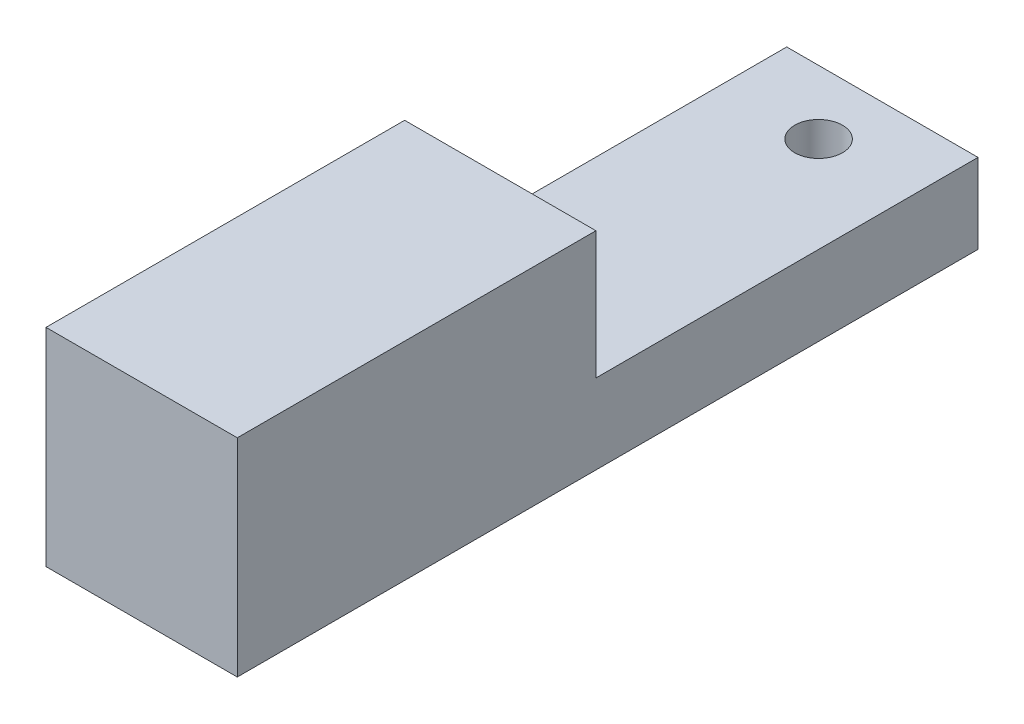
ISO-10303-21;
HEADER;
FILE_DESCRIPTION(('STEP AP214'),'2;1');
FILE_NAME('part.step','',(''),(''),'','','');
FILE_SCHEMA(('AUTOMOTIVE_DESIGN { 1 0 10303 214 1 1 1 1 }'));
ENDSEC;
DATA;
#1=APPLICATION_CONTEXT('core data for automotive mechanical design processes');
#2=APPLICATION_PROTOCOL_DEFINITION('international standard','automotive_design',2000,#1);
#3=PRODUCT_CONTEXT('',#1,'mechanical');
#4=PRODUCT('Part','Part','',(#3));
#5=PRODUCT_RELATED_PRODUCT_CATEGORY('part','',(#4));
#6=PRODUCT_DEFINITION_FORMATION('','',#4);
#7=PRODUCT_DEFINITION_CONTEXT('part definition',#1,'design');
#8=PRODUCT_DEFINITION('design','',#6,#7);
#9=PRODUCT_DEFINITION_SHAPE('','',#8);
#10=(LENGTH_UNIT() NAMED_UNIT(*) SI_UNIT(.MILLI.,.METRE.));
#11=(NAMED_UNIT(*) PLANE_ANGLE_UNIT() SI_UNIT($,.RADIAN.));
#12=(NAMED_UNIT(*) SI_UNIT($,.STERADIAN.) SOLID_ANGLE_UNIT());
#13=UNCERTAINTY_MEASURE_WITH_UNIT(LENGTH_MEASURE(1.E-05),#10,'distance_accuracy_value','');
#14=(GEOMETRIC_REPRESENTATION_CONTEXT(3) GLOBAL_UNCERTAINTY_ASSIGNED_CONTEXT((#13)) GLOBAL_UNIT_ASSIGNED_CONTEXT((#10,
#11,#12)) REPRESENTATION_CONTEXT('',''));
#15=CARTESIAN_POINT('',(0.,0.,0.));
#16=DIRECTION('',(0.,0.,1.));
#17=DIRECTION('',(1.,0.,0.));
#18=AXIS2_PLACEMENT_3D('',#15,#16,#17);
#19=CARTESIAN_POINT('',(-5.99999999999999,-5.,-23.235));
#20=DIRECTION('',(-1.,0.,0.));
#21=DIRECTION('',(0.,0.,1.));
#22=AXIS2_PLACEMENT_3D('',#19,#20,#21);
#23=PLANE('',#22);
#24=DIRECTION('',(0.,0.,1.));
#25=VECTOR('',#24,1.);
#26=CARTESIAN_POINT('',(-5.99999999999999,0.,-23.235));
#27=LINE('',#26,#25);
#28=CARTESIAN_POINT('',(-5.99999999999999,0.,-23.235));
#29=VERTEX_POINT('',#28);
#30=CARTESIAN_POINT('',(-5.99999999999999,0.,0.735));
#31=VERTEX_POINT('',#30);
#32=EDGE_CURVE('E128',#29,#31,#27,.T.);
#33=ORIENTED_EDGE('',*,*,#32,.F.);
#34=DIRECTION('',(0.,1.,0.));
#35=VECTOR('',#34,1.);
#36=CARTESIAN_POINT('',(-5.99999999999999,-5.,-23.235));
#37=LINE('',#36,#35);
#38=CARTESIAN_POINT('',(-5.99999999999999,-5.,-23.235));
#39=VERTEX_POINT('',#38);
#40=EDGE_CURVE('E11',#39,#29,#37,.T.);
#41=ORIENTED_EDGE('',*,*,#40,.F.);
#42=DIRECTION('',(0.,0.,1.));
#43=VECTOR('',#42,1.);
#44=CARTESIAN_POINT('',(-5.99999999999999,-5.,-23.235));
#45=LINE('',#44,#43);
#46=CARTESIAN_POINT('',(-5.99999999999999,-5.,23.235));
#47=VERTEX_POINT('',#46);
#48=EDGE_CURVE('E94',#39,#47,#45,.T.);
#49=ORIENTED_EDGE('',*,*,#48,.T.);
#50=DIRECTION('',(0.,1.,0.));
#51=VECTOR('',#50,1.);
#52=CARTESIAN_POINT('',(-5.99999999999999,-5.,23.235));
#53=LINE('',#52,#51);
#54=CARTESIAN_POINT('',(-5.99999999999999,8.,23.235));
#55=VERTEX_POINT('',#54);
#56=EDGE_CURVE('E36',#47,#55,#53,.T.);
#57=ORIENTED_EDGE('',*,*,#56,.T.);
#58=DIRECTION('',(0.,0.,1.));
#59=VECTOR('',#58,1.);
#60=CARTESIAN_POINT('',(-5.99999999999999,8.,23.235));
#61=LINE('',#60,#59);
#62=CARTESIAN_POINT('',(-5.99999999999999,8.,0.735));
#63=VERTEX_POINT('',#62);
#64=EDGE_CURVE('E93',#63,#55,#61,.T.);
#65=ORIENTED_EDGE('',*,*,#64,.F.);
#66=DIRECTION('',(0.,-1.,0.));
#67=VECTOR('',#66,1.);
#68=CARTESIAN_POINT('',(-5.99999999999999,8.,0.735));
#69=LINE('',#68,#67);
#70=EDGE_CURVE('E112',#63,#31,#69,.T.);
#71=ORIENTED_EDGE('',*,*,#70,.T.);
#72=EDGE_LOOP('',(#33,#41,#49,#57,#65,#71));
#73=FACE_BOUND('',#72,.T.);
#74=ADVANCED_FACE('F33',(#73),#23,.T.);
#75=CARTESIAN_POINT('',(-5.99999999999999,-5.,-23.235));
#76=DIRECTION('',(0.,0.,-1.));
#77=DIRECTION('',(-1.,0.,0.));
#78=AXIS2_PLACEMENT_3D('',#75,#76,#77);
#79=PLANE('',#78);
#80=DIRECTION('',(-1.,0.,0.));
#81=VECTOR('',#80,1.);
#82=CARTESIAN_POINT('',(-5.99999999999999,0.,-23.235));
#83=LINE('',#82,#81);
#84=CARTESIAN_POINT('',(5.99999999999999,0.,-23.235));
#85=VERTEX_POINT('',#84);
#86=EDGE_CURVE('E133',#85,#29,#83,.T.);
#87=ORIENTED_EDGE('',*,*,#86,.F.);
#88=DIRECTION('',(0.,1.,0.));
#89=VECTOR('',#88,1.);
#90=CARTESIAN_POINT('',(5.99999999999999,-5.,-23.235));
#91=LINE('',#90,#89);
#92=CARTESIAN_POINT('',(5.99999999999999,-5.,-23.235));
#93=VERTEX_POINT('',#92);
#94=EDGE_CURVE('E41',#93,#85,#91,.T.);
#95=ORIENTED_EDGE('',*,*,#94,.F.);
#96=DIRECTION('',(-1.,0.,0.));
#97=VECTOR('',#96,1.);
#98=CARTESIAN_POINT('',(-5.99999999999999,-5.,-23.235));
#99=LINE('',#98,#97);
#100=EDGE_CURVE('E96',#93,#39,#99,.T.);
#101=ORIENTED_EDGE('',*,*,#100,.T.);
#102=ORIENTED_EDGE('',*,*,#40,.T.);
#103=EDGE_LOOP('',(#87,#95,#101,#102));
#104=FACE_BOUND('',#103,.T.);
#105=ADVANCED_FACE('F150',(#104),#79,.T.);
#106=CARTESIAN_POINT('',(5.99999999999999,-5.,-23.235));
#107=DIRECTION('',(1.,0.,0.));
#108=DIRECTION('',(0.,0.,-1.));
#109=AXIS2_PLACEMENT_3D('',#106,#107,#108);
#110=PLANE('',#109);
#111=DIRECTION('',(0.,0.,-1.));
#112=VECTOR('',#111,1.);
#113=CARTESIAN_POINT('',(5.99999999999999,0.,-23.235));
#114=LINE('',#113,#112);
#115=CARTESIAN_POINT('',(5.99999999999999,0.,0.734999999999993));
#116=VERTEX_POINT('',#115);
#117=EDGE_CURVE('E140',#116,#85,#114,.T.);
#118=ORIENTED_EDGE('',*,*,#117,.F.);
#119=DIRECTION('',(0.,-1.,0.));
#120=VECTOR('',#119,1.);
#121=CARTESIAN_POINT('',(5.99999999999999,8.,0.735));
#122=LINE('',#121,#120);
#123=CARTESIAN_POINT('',(5.99999999999999,8.,0.735));
#124=VERTEX_POINT('',#123);
#125=EDGE_CURVE('E115',#124,#116,#122,.T.);
#126=ORIENTED_EDGE('',*,*,#125,.F.);
#127=DIRECTION('',(0.,0.,-1.));
#128=VECTOR('',#127,1.);
#129=CARTESIAN_POINT('',(5.99999999999999,8.,23.235));
#130=LINE('',#129,#128);
#131=CARTESIAN_POINT('',(5.99999999999999,8.,23.235));
#132=VERTEX_POINT('',#131);
#133=EDGE_CURVE('E102',#132,#124,#130,.T.);
#134=ORIENTED_EDGE('',*,*,#133,.F.);
#135=DIRECTION('',(0.,1.,0.));
#136=VECTOR('',#135,1.);
#137=CARTESIAN_POINT('',(5.99999999999999,-5.,23.235));
#138=LINE('',#137,#136);
#139=CARTESIAN_POINT('',(5.99999999999999,-5.,23.235));
#140=VERTEX_POINT('',#139);
#141=EDGE_CURVE('E95',#140,#132,#138,.T.);
#142=ORIENTED_EDGE('',*,*,#141,.F.);
#143=DIRECTION('',(0.,0.,-1.));
#144=VECTOR('',#143,1.);
#145=CARTESIAN_POINT('',(5.99999999999999,-5.,-23.235));
#146=LINE('',#145,#144);
#147=EDGE_CURVE('E135',#140,#93,#146,.T.);
#148=ORIENTED_EDGE('',*,*,#147,.T.);
#149=ORIENTED_EDGE('',*,*,#94,.T.);
#150=EDGE_LOOP('',(#118,#126,#134,#142,#148,#149));
#151=FACE_BOUND('',#150,.T.);
#152=ADVANCED_FACE('F146',(#151),#110,.T.);
#153=CARTESIAN_POINT('',(-5.99999999999999,-5.,23.235));
#154=DIRECTION('',(0.,0.,1.));
#155=DIRECTION('',(1.,0.,0.));
#156=AXIS2_PLACEMENT_3D('',#153,#154,#155);
#157=PLANE('',#156);
#158=ORIENTED_EDGE('',*,*,#141,.T.);
#159=DIRECTION('',(1.,0.,0.));
#160=VECTOR('',#159,1.);
#161=CARTESIAN_POINT('',(-5.99999999999999,8.,23.235));
#162=LINE('',#161,#160);
#163=EDGE_CURVE('E98',#55,#132,#162,.T.);
#164=ORIENTED_EDGE('',*,*,#163,.F.);
#165=ORIENTED_EDGE('',*,*,#56,.F.);
#166=DIRECTION('',(1.,0.,0.));
#167=VECTOR('',#166,1.);
#168=CARTESIAN_POINT('',(-5.99999999999999,-5.,23.235));
#169=LINE('',#168,#167);
#170=EDGE_CURVE('E132',#47,#140,#169,.T.);
#171=ORIENTED_EDGE('',*,*,#170,.T.);
#172=EDGE_LOOP('',(#158,#164,#165,#171));
#173=FACE_BOUND('',#172,.T.);
#174=ADVANCED_FACE('F99',(#173),#157,.T.);
#175=CARTESIAN_POINT('',(0.,-5.,0.));
#176=DIRECTION('',(0.,1.,0.));
#177=DIRECTION('',(0.,0.,1.));
#178=AXIS2_PLACEMENT_3D('',#175,#176,#177);
#179=PLANE('',#178);
#180=CARTESIAN_POINT('',(0.,-5.,-1.765));
#181=DIRECTION('',(0.,1.,0.));
#182=DIRECTION('',(0.,0.,1.));
#183=AXIS2_PLACEMENT_3D('',#180,#181,#182);
#184=CIRCLE('',#183,1.5);
#185=CARTESIAN_POINT('',(0.,-5.,-0.265000000000001));
#186=VERTEX_POINT('',#185);
#187=EDGE_CURVE('E119',#186,#186,#184,.T.);
#188=ORIENTED_EDGE('',*,*,#187,.T.);
#189=EDGE_LOOP('',(#188));
#190=FACE_BOUND('',#189,.T.);
#191=CARTESIAN_POINT('',(0.,-5.,-19.235));
#192=DIRECTION('',(0.,1.,0.));
#193=DIRECTION('',(0.,0.,1.));
#194=AXIS2_PLACEMENT_3D('',#191,#192,#193);
#195=CIRCLE('',#194,1.5);
#196=CARTESIAN_POINT('',(0.,-5.,-17.735));
#197=VERTEX_POINT('',#196);
#198=EDGE_CURVE('E125',#197,#197,#195,.T.);
#199=ORIENTED_EDGE('',*,*,#198,.T.);
#200=EDGE_LOOP('',(#199));
#201=FACE_BOUND('',#200,.T.);
#202=ORIENTED_EDGE('',*,*,#48,.F.);
#203=ORIENTED_EDGE('',*,*,#100,.F.);
#204=ORIENTED_EDGE('',*,*,#147,.F.);
#205=ORIENTED_EDGE('',*,*,#170,.F.);
#206=EDGE_LOOP('',(#202,#203,#204,#205));
#207=FACE_BOUND('',#206,.T.);
#208=ADVANCED_FACE('F156',(#190,#201,#207),#179,.F.);
#209=CARTESIAN_POINT('',(0.,0.,0.));
#210=DIRECTION('',(0.,1.,0.));
#211=DIRECTION('',(0.,0.,1.));
#212=AXIS2_PLACEMENT_3D('',#209,#210,#211);
#213=PLANE('',#212);
#214=DIRECTION('',(-1.,0.,0.));
#215=VECTOR('',#214,1.);
#216=CARTESIAN_POINT('',(-5.99999999999999,0.,0.735));
#217=LINE('',#216,#215);
#218=EDGE_CURVE('E49',#116,#31,#217,.T.);
#219=ORIENTED_EDGE('',*,*,#218,.F.);
#220=ORIENTED_EDGE('',*,*,#117,.T.);
#221=ORIENTED_EDGE('',*,*,#86,.T.);
#222=ORIENTED_EDGE('',*,*,#32,.T.);
#223=EDGE_LOOP('',(#219,#220,#221,#222));
#224=FACE_BOUND('',#223,.T.);
#225=CARTESIAN_POINT('',(0.,0.,-1.765));
#226=DIRECTION('',(0.,1.,0.));
#227=DIRECTION('',(0.,0.,1.));
#228=AXIS2_PLACEMENT_3D('',#225,#226,#227);
#229=CIRCLE('',#228,1.5);
#230=CARTESIAN_POINT('',(0.,0.,-0.265000000000001));
#231=VERTEX_POINT('',#230);
#232=EDGE_CURVE('E118',#231,#231,#229,.T.);
#233=ORIENTED_EDGE('',*,*,#232,.F.);
#234=EDGE_LOOP('',(#233));
#235=FACE_BOUND('',#234,.T.);
#236=CARTESIAN_POINT('',(0.,0.,-19.235));
#237=DIRECTION('',(0.,1.,0.));
#238=DIRECTION('',(0.,0.,1.));
#239=AXIS2_PLACEMENT_3D('',#236,#237,#238);
#240=CIRCLE('',#239,1.5);
#241=CARTESIAN_POINT('',(0.,0.,-17.735));
#242=VERTEX_POINT('',#241);
#243=EDGE_CURVE('E122',#242,#242,#240,.T.);
#244=ORIENTED_EDGE('',*,*,#243,.F.);
#245=EDGE_LOOP('',(#244));
#246=FACE_BOUND('',#245,.T.);
#247=ADVANCED_FACE('F151',(#224,#235,#246),#213,.T.);
#248=CARTESIAN_POINT('',(0.,-5.,-19.235));
#249=DIRECTION('',(0.,1.,0.));
#250=DIRECTION('',(0.,0.,1.));
#251=AXIS2_PLACEMENT_3D('',#248,#249,#250);
#252=CYLINDRICAL_SURFACE('',#251,1.5);
#253=ORIENTED_EDGE('',*,*,#198,.F.);
#254=EDGE_LOOP('',(#253));
#255=FACE_BOUND('',#254,.T.);
#256=ORIENTED_EDGE('',*,*,#243,.T.);
#257=EDGE_LOOP('',(#256));
#258=FACE_BOUND('',#257,.T.);
#259=ADVANCED_FACE('F164',(#255,#258),#252,.F.);
#260=CARTESIAN_POINT('',(0.,-5.,-1.765));
#261=DIRECTION('',(0.,1.,0.));
#262=DIRECTION('',(0.,0.,1.));
#263=AXIS2_PLACEMENT_3D('',#260,#261,#262);
#264=CYLINDRICAL_SURFACE('',#263,1.5);
#265=ORIENTED_EDGE('',*,*,#187,.F.);
#266=EDGE_LOOP('',(#265));
#267=FACE_BOUND('',#266,.T.);
#268=ORIENTED_EDGE('',*,*,#232,.T.);
#269=EDGE_LOOP('',(#268));
#270=FACE_BOUND('',#269,.T.);
#271=ADVANCED_FACE('F202',(#267,#270),#264,.F.);
#272=CARTESIAN_POINT('',(-5.99999999999999,8.,0.735));
#273=DIRECTION('',(0.,0.,1.));
#274=DIRECTION('',(1.,0.,0.));
#275=AXIS2_PLACEMENT_3D('',#272,#273,#274);
#276=PLANE('',#275);
#277=ORIENTED_EDGE('',*,*,#218,.T.);
#278=ORIENTED_EDGE('',*,*,#70,.F.);
#279=DIRECTION('',(-1.,0.,0.));
#280=VECTOR('',#279,1.);
#281=CARTESIAN_POINT('',(-5.99999999999999,8.,0.735));
#282=LINE('',#281,#280);
#283=EDGE_CURVE('E106',#124,#63,#282,.T.);
#284=ORIENTED_EDGE('',*,*,#283,.F.);
#285=ORIENTED_EDGE('',*,*,#125,.T.);
#286=EDGE_LOOP('',(#277,#278,#284,#285));
#287=FACE_BOUND('',#286,.T.);
#288=ADVANCED_FACE('F154',(#287),#276,.F.);
#289=CARTESIAN_POINT('',(0.,8.,0.));
#290=DIRECTION('',(0.,-1.,0.));
#291=DIRECTION('',(0.,0.,-1.));
#292=AXIS2_PLACEMENT_3D('',#289,#290,#291);
#293=PLANE('',#292);
#294=ORIENTED_EDGE('',*,*,#64,.T.);
#295=ORIENTED_EDGE('',*,*,#163,.T.);
#296=ORIENTED_EDGE('',*,*,#133,.T.);
#297=ORIENTED_EDGE('',*,*,#283,.T.);
#298=EDGE_LOOP('',(#294,#295,#296,#297));
#299=FACE_BOUND('',#298,.T.);
#300=ADVANCED_FACE('F104',(#299),#293,.F.);
#301=CLOSED_SHELL('',(#74,#105,#152,#174,#208,#247,#259,#271,#288,#300));
#302=MANIFOLD_SOLID_BREP('B2',#301);
#303=ADVANCED_BREP_SHAPE_REPRESENTATION('',(#18,#302),#14);
#304=SHAPE_DEFINITION_REPRESENTATION(#9,#303);
ENDSEC;
END-ISO-10303-21;
